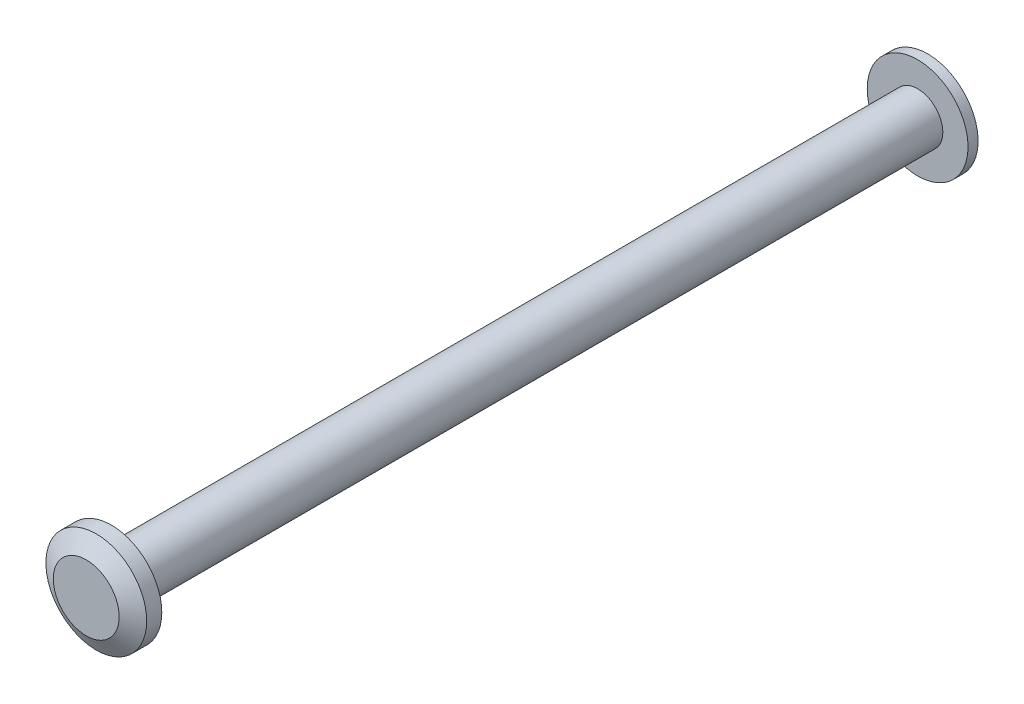
ISO-10303-21;
HEADER;
FILE_DESCRIPTION(('STEP AP214'),'2;1');
FILE_NAME('part.step','',(''),(''),'','','');
FILE_SCHEMA(('AUTOMOTIVE_DESIGN { 1 0 10303 214 1 1 1 1 }'));
ENDSEC;
DATA;
#1=APPLICATION_CONTEXT('core data for automotive mechanical design processes');
#2=APPLICATION_PROTOCOL_DEFINITION('international standard','automotive_design',2000,#1);
#3=PRODUCT_CONTEXT('',#1,'mechanical');
#4=PRODUCT('Part','Part','',(#3));
#5=PRODUCT_RELATED_PRODUCT_CATEGORY('part','',(#4));
#6=PRODUCT_DEFINITION_FORMATION('','',#4);
#7=PRODUCT_DEFINITION_CONTEXT('part definition',#1,'design');
#8=PRODUCT_DEFINITION('design','',#6,#7);
#9=PRODUCT_DEFINITION_SHAPE('','',#8);
#10=(LENGTH_UNIT() NAMED_UNIT(*) SI_UNIT(.MILLI.,.METRE.));
#11=(NAMED_UNIT(*) PLANE_ANGLE_UNIT() SI_UNIT($,.RADIAN.));
#12=(NAMED_UNIT(*) SI_UNIT($,.STERADIAN.) SOLID_ANGLE_UNIT());
#13=UNCERTAINTY_MEASURE_WITH_UNIT(LENGTH_MEASURE(1.E-05),#10,'distance_accuracy_value','');
#14=(GEOMETRIC_REPRESENTATION_CONTEXT(3) GLOBAL_UNCERTAINTY_ASSIGNED_CONTEXT((#13)) GLOBAL_UNIT_ASSIGNED_CONTEXT((#10,
#11,#12)) REPRESENTATION_CONTEXT('',''));
#15=CARTESIAN_POINT('',(0.,0.,0.));
#16=DIRECTION('',(0.,0.,1.));
#17=DIRECTION('',(1.,0.,0.));
#18=AXIS2_PLACEMENT_3D('',#15,#16,#17);
#19=CARTESIAN_POINT('',(0.,0.,16.));
#20=DIRECTION('',(0.,0.,-1.));
#21=DIRECTION('',(-1.,0.,0.));
#22=AXIS2_PLACEMENT_3D('',#19,#20,#21);
#23=CYLINDRICAL_SURFACE('',#22,0.5);
#24=CARTESIAN_POINT('',(0.,0.,16.));
#25=DIRECTION('',(0.,0.,1.));
#26=DIRECTION('',(1.,0.,0.));
#27=AXIS2_PLACEMENT_3D('',#24,#25,#26);
#28=CIRCLE('',#27,0.5);
#29=CARTESIAN_POINT('',(0.5,0.,16.));
#30=VERTEX_POINT('',#29);
#31=EDGE_CURVE('E50',#30,#30,#28,.T.);
#32=ORIENTED_EDGE('',*,*,#31,.F.);
#33=EDGE_LOOP('',(#32));
#34=FACE_BOUND('',#33,.T.);
#35=CARTESIAN_POINT('',(0.,0.,0.));
#36=DIRECTION('',(0.,0.,1.));
#37=DIRECTION('',(1.,0.,0.));
#38=AXIS2_PLACEMENT_3D('',#35,#36,#37);
#39=CIRCLE('',#38,0.5);
#40=CARTESIAN_POINT('',(0.5,0.,0.));
#41=VERTEX_POINT('',#40);
#42=EDGE_CURVE('E51',#41,#41,#39,.T.);
#43=ORIENTED_EDGE('',*,*,#42,.T.);
#44=EDGE_LOOP('',(#43));
#45=FACE_BOUND('',#44,.T.);
#46=ADVANCED_FACE('F30',(#34,#45),#23,.T.);
#47=CARTESIAN_POINT('',(0.,0.,-0.4));
#48=DIRECTION('',(0.,0.,1.));
#49=DIRECTION('',(1.,0.,0.));
#50=AXIS2_PLACEMENT_3D('',#47,#48,#49);
#51=CYLINDRICAL_SURFACE('',#50,1.);
#52=CARTESIAN_POINT('',(0.,0.,-0.200000000000001));
#53=DIRECTION('',(0.,0.,-1.));
#54=DIRECTION('',(-1.,0.,0.));
#55=AXIS2_PLACEMENT_3D('',#52,#53,#54);
#56=CIRCLE('',#55,1.);
#57=CARTESIAN_POINT('',(-1.,0.,-0.200000000000001));
#58=VERTEX_POINT('',#57);
#59=EDGE_CURVE('E41',#58,#58,#56,.F.);
#60=ORIENTED_EDGE('',*,*,#59,.T.);
#61=EDGE_LOOP('',(#60));
#62=FACE_BOUND('',#61,.T.);
#63=CARTESIAN_POINT('',(0.,0.,0.));
#64=DIRECTION('',(0.,0.,-1.));
#65=DIRECTION('',(-1.,0.,0.));
#66=AXIS2_PLACEMENT_3D('',#63,#64,#65);
#67=CIRCLE('',#66,1.);
#68=CARTESIAN_POINT('',(-1.,0.,0.));
#69=VERTEX_POINT('',#68);
#70=EDGE_CURVE('E54',#69,#69,#67,.T.);
#71=ORIENTED_EDGE('',*,*,#70,.T.);
#72=EDGE_LOOP('',(#71));
#73=FACE_BOUND('',#72,.T.);
#74=ADVANCED_FACE('F78',(#62,#73),#51,.T.);
#75=CARTESIAN_POINT('',(0.,0.,-0.4));
#76=DIRECTION('',(0.,0.,-1.));
#77=DIRECTION('',(-1.,0.,0.));
#78=AXIS2_PLACEMENT_3D('',#75,#76,#77);
#79=PLANE('',#78);
#80=CARTESIAN_POINT('',(0.,0.,-0.4));
#81=DIRECTION('',(0.,0.,-1.));
#82=DIRECTION('',(-1.,0.,0.));
#83=AXIS2_PLACEMENT_3D('',#80,#81,#82);
#84=CIRCLE('',#83,0.653589838486226);
#85=CARTESIAN_POINT('',(-0.653589838486226,0.,-0.4));
#86=VERTEX_POINT('',#85);
#87=EDGE_CURVE('E45',#86,#86,#84,.T.);
#88=ORIENTED_EDGE('',*,*,#87,.T.);
#89=EDGE_LOOP('',(#88));
#90=FACE_BOUND('',#89,.T.);
#91=ADVANCED_FACE('F84',(#90),#79,.T.);
#92=CARTESIAN_POINT('',(0.,0.,0.));
#93=DIRECTION('',(0.,0.,-1.));
#94=DIRECTION('',(-1.,0.,0.));
#95=AXIS2_PLACEMENT_3D('',#92,#93,#94);
#96=PLANE('',#95);
#97=ORIENTED_EDGE('',*,*,#42,.F.);
#98=EDGE_LOOP('',(#97));
#99=FACE_BOUND('',#98,.T.);
#100=ORIENTED_EDGE('',*,*,#70,.F.);
#101=EDGE_LOOP('',(#100));
#102=FACE_BOUND('',#101,.T.);
#103=ADVANCED_FACE('F92',(#99,#102),#96,.F.);
#104=CARTESIAN_POINT('',(0.,0.,-0.4));
#105=DIRECTION('',(0.,0.,1.));
#106=DIRECTION('',(1.,0.,0.));
#107=AXIS2_PLACEMENT_3D('',#104,#105,#106);
#108=CONICAL_SURFACE('',#107,0.653589838486226,1.0471975511966);
#109=ORIENTED_EDGE('',*,*,#59,.F.);
#110=EDGE_LOOP('',(#109));
#111=FACE_BOUND('',#110,.T.);
#112=ORIENTED_EDGE('',*,*,#87,.F.);
#113=EDGE_LOOP('',(#112));
#114=FACE_BOUND('',#113,.T.);
#115=ADVANCED_FACE('F90',(#111,#114),#108,.T.);
#116=CARTESIAN_POINT('',(0.,0.,16.5));
#117=DIRECTION('',(0.,0.,-1.));
#118=DIRECTION('',(-1.,0.,0.));
#119=AXIS2_PLACEMENT_3D('',#116,#117,#118);
#120=CYLINDRICAL_SURFACE('',#119,1.);
#121=CARTESIAN_POINT('',(0.,0.,16.3));
#122=DIRECTION('',(0.,0.,1.));
#123=DIRECTION('',(1.,0.,0.));
#124=AXIS2_PLACEMENT_3D('',#121,#122,#123);
#125=CIRCLE('',#124,1.);
#126=CARTESIAN_POINT('',(1.,0.,16.3));
#127=VERTEX_POINT('',#126);
#128=EDGE_CURVE('E10',#127,#127,#125,.F.);
#129=ORIENTED_EDGE('',*,*,#128,.T.);
#130=EDGE_LOOP('',(#129));
#131=FACE_BOUND('',#130,.T.);
#132=CARTESIAN_POINT('',(0.,0.,16.));
#133=DIRECTION('',(0.,0.,1.));
#134=DIRECTION('',(1.,0.,0.));
#135=AXIS2_PLACEMENT_3D('',#132,#133,#134);
#136=CIRCLE('',#135,1.);
#137=CARTESIAN_POINT('',(1.,0.,16.));
#138=VERTEX_POINT('',#137);
#139=EDGE_CURVE('E59',#138,#138,#136,.T.);
#140=ORIENTED_EDGE('',*,*,#139,.T.);
#141=EDGE_LOOP('',(#140));
#142=FACE_BOUND('',#141,.T.);
#143=ADVANCED_FACE('F63',(#131,#142),#120,.T.);
#144=CARTESIAN_POINT('',(0.,0.,16.5));
#145=DIRECTION('',(0.,0.,1.));
#146=DIRECTION('',(1.,0.,0.));
#147=AXIS2_PLACEMENT_3D('',#144,#145,#146);
#148=PLANE('',#147);
#149=CARTESIAN_POINT('',(0.,0.,16.5));
#150=DIRECTION('',(0.,0.,1.));
#151=DIRECTION('',(1.,0.,0.));
#152=AXIS2_PLACEMENT_3D('',#149,#150,#151);
#153=CIRCLE('',#152,0.653589838486228);
#154=CARTESIAN_POINT('',(0.653589838486228,0.,16.5));
#155=VERTEX_POINT('',#154);
#156=EDGE_CURVE('E37',#155,#155,#153,.T.);
#157=ORIENTED_EDGE('',*,*,#156,.T.);
#158=EDGE_LOOP('',(#157));
#159=FACE_BOUND('',#158,.T.);
#160=ADVANCED_FACE('F67',(#159),#148,.T.);
#161=CARTESIAN_POINT('',(0.,0.,16.));
#162=DIRECTION('',(0.,0.,1.));
#163=DIRECTION('',(1.,0.,0.));
#164=AXIS2_PLACEMENT_3D('',#161,#162,#163);
#165=PLANE('',#164);
#166=ORIENTED_EDGE('',*,*,#31,.T.);
#167=EDGE_LOOP('',(#166));
#168=FACE_BOUND('',#167,.T.);
#169=ORIENTED_EDGE('',*,*,#139,.F.);
#170=EDGE_LOOP('',(#169));
#171=FACE_BOUND('',#170,.T.);
#172=ADVANCED_FACE('F65',(#168,#171),#165,.F.);
#173=CARTESIAN_POINT('',(0.,0.,16.5));
#174=DIRECTION('',(0.,0.,-1.));
#175=DIRECTION('',(-1.,0.,0.));
#176=AXIS2_PLACEMENT_3D('',#173,#174,#175);
#177=CONICAL_SURFACE('',#176,0.653589838486228,1.0471975511966);
#178=ORIENTED_EDGE('',*,*,#128,.F.);
#179=EDGE_LOOP('',(#178));
#180=FACE_BOUND('',#179,.T.);
#181=ORIENTED_EDGE('',*,*,#156,.F.);
#182=EDGE_LOOP('',(#181));
#183=FACE_BOUND('',#182,.T.);
#184=ADVANCED_FACE('F32',(#180,#183),#177,.T.);
#185=CLOSED_SHELL('',(#46,#74,#91,#103,#115,#143,#160,#172,#184));
#186=MANIFOLD_SOLID_BREP('B2',#185);
#187=ADVANCED_BREP_SHAPE_REPRESENTATION('',(#18,#186),#14);
#188=SHAPE_DEFINITION_REPRESENTATION(#9,#187);
ENDSEC;
END-ISO-10303-21;
